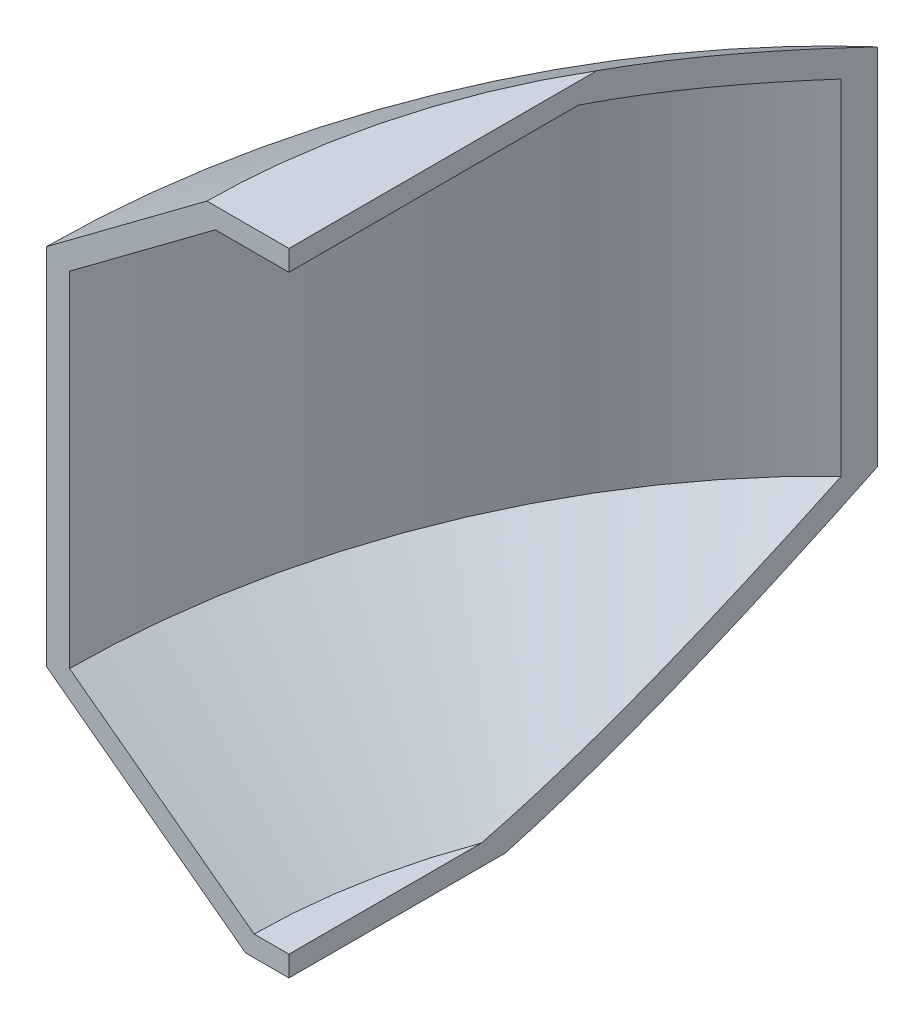
ISO-10303-21;
HEADER;
FILE_DESCRIPTION(('STEP AP214'),'2;1');
FILE_NAME('part.step','',(''),(''),'','','');
FILE_SCHEMA(('AUTOMOTIVE_DESIGN { 1 0 10303 214 1 1 1 1 }'));
ENDSEC;
DATA;
#1=APPLICATION_CONTEXT('core data for automotive mechanical design processes');
#2=APPLICATION_PROTOCOL_DEFINITION('international standard','automotive_design',2000,#1);
#3=PRODUCT_CONTEXT('',#1,'mechanical');
#4=PRODUCT('Part','Part','',(#3));
#5=PRODUCT_RELATED_PRODUCT_CATEGORY('part','',(#4));
#6=PRODUCT_DEFINITION_FORMATION('','',#4);
#7=PRODUCT_DEFINITION_CONTEXT('part definition',#1,'design');
#8=PRODUCT_DEFINITION('design','',#6,#7);
#9=PRODUCT_DEFINITION_SHAPE('','',#8);
#10=(LENGTH_UNIT() NAMED_UNIT(*) SI_UNIT(.MILLI.,.METRE.));
#11=(NAMED_UNIT(*) PLANE_ANGLE_UNIT() SI_UNIT($,.RADIAN.));
#12=(NAMED_UNIT(*) SI_UNIT($,.STERADIAN.) SOLID_ANGLE_UNIT());
#13=UNCERTAINTY_MEASURE_WITH_UNIT(LENGTH_MEASURE(1.E-05),#10,'distance_accuracy_value','');
#14=(GEOMETRIC_REPRESENTATION_CONTEXT(3) GLOBAL_UNCERTAINTY_ASSIGNED_CONTEXT((#13)) GLOBAL_UNIT_ASSIGNED_CONTEXT((#10,
#11,#12)) REPRESENTATION_CONTEXT('',''));
#15=CARTESIAN_POINT('',(0.,0.,0.));
#16=DIRECTION('',(0.,0.,1.));
#17=DIRECTION('',(1.,0.,0.));
#18=AXIS2_PLACEMENT_3D('',#15,#16,#17);
#19=CARTESIAN_POINT('',(-308.554799780113,77.7625120885841,-149.499973367811));
#20=DIRECTION('',(0.,1.,0.));
#21=DIRECTION('',(-1.,0.,0.));
#22=AXIS2_PLACEMENT_3D('',#19,#20,#21);
#23=PLANE('',#22);
#24=DIRECTION('',(1.,0.,0.));
#25=VECTOR('',#24,1.);
#26=CARTESIAN_POINT('',(-308.554799780113,77.7625120885841,-150.));
#27=LINE('',#26,#25);
#28=CARTESIAN_POINT('',(-308.553136985618,77.7625120885841,-150.));
#29=VERTEX_POINT('',#28);
#30=CARTESIAN_POINT('',(-300.,77.7625120885841,-149.999999999977));
#31=VERTEX_POINT('',#30);
#32=EDGE_CURVE('E248',#29,#31,#27,.T.);
#33=ORIENTED_EDGE('',*,*,#32,.F.);
#34=CARTESIAN_POINT('',(-262.506364446809,77.7625120885841,-208.339640738144));
#35=CARTESIAN_POINT('',(-289.480913338998,77.7625120885842,-208.339640738144));
#36=CARTESIAN_POINT('',(-308.554799780113,77.7625120885842,-183.96745250783));
#37=CARTESIAN_POINT('',(-308.554799780113,77.7625120885841,-149.499973367811));
#38=(BOUNDED_CURVE() B_SPLINE_CURVE(3,(#34,#35,#36,#37),.UNSPECIFIED.,.F.,
.F.) B_SPLINE_CURVE_WITH_KNOTS((4,4),(0.,1.),
.UNSPECIFIED.) CURVE() GEOMETRIC_REPRESENTATION_ITEM() RATIONAL_B_SPLINE_CURVE((1.,
0.804737854124365,0.804737854124365,1.)) REPRESENTATION_ITEM(''));
#39=CARTESIAN_POINT('',(-300.,77.7625120885841,-183.659581031771));
#40=VERTEX_POINT('',#39);
#41=EDGE_CURVE('E140',#40,#29,#38,.T.);
#42=ORIENTED_EDGE('',*,*,#41,.F.);
#43=DIRECTION('',(0.,0.,-1.));
#44=VECTOR('',#43,1.);
#45=CARTESIAN_POINT('',(-300.,77.7625120885841,-149.499973367811));
#46=LINE('',#45,#44);
#47=EDGE_CURVE('E249',#31,#40,#46,.T.);
#48=ORIENTED_EDGE('',*,*,#47,.F.);
#49=EDGE_LOOP('',(#33,#42,#48));
#50=FACE_BOUND('',#49,.T.);
#51=ADVANCED_FACE('F34',(#50),#23,.F.);
#52=CARTESIAN_POINT('',(-262.506364446809,25.118910613293,-68.9999733678111));
#53=CARTESIAN_POINT('',(-136.506364446809,25.118910613293,-68.9999733678111));
#54=CARTESIAN_POINT('',(-136.506364446809,25.118910613293,-229.999973367811));
#55=CARTESIAN_POINT('',(-262.506364446809,25.118910613293,-229.999973367811));
#56=CARTESIAN_POINT('',(-388.506364446809,25.118910613293,-229.999973367811));
#57=CARTESIAN_POINT('',(-388.506364446809,25.118910613293,-68.9999733678111));
#58=CARTESIAN_POINT('',(-262.506364446809,25.118910613293,-68.9999733678111));
#59=CARTESIAN_POINT('',(-262.506364446809,9.11891061329302,-96.4103059974782));
#60=CARTESIAN_POINT('',(-179.409493780201,9.11891061329302,-96.4103059974782));
#61=CARTESIAN_POINT('',(-179.409493780201,9.11891061329302,-202.589640738144));
#62=CARTESIAN_POINT('',(-262.506364446809,9.11891061329301,-202.589640738144));
#63=CARTESIAN_POINT('',(-345.603235113417,9.11891061329302,-202.589640738144));
#64=CARTESIAN_POINT('',(-345.603235113417,9.11891061329302,-96.4103059974782));
#65=CARTESIAN_POINT('',(-262.506364446809,9.11891061329302,-96.4103059974782));
#66=(BOUNDED_SURFACE() B_SPLINE_SURFACE(1,3,((#52,#53,#54,#55,#56,#57,#58),(#59,#60,#61,#62,#63,
#64,#65)),.UNSPECIFIED.,.F.,.T.,.F.) B_SPLINE_SURFACE_WITH_KNOTS((2,2),(4,3,4),(0.,1.),(0.,0.5,
1.),.UNSPECIFIED.) GEOMETRIC_REPRESENTATION_ITEM() RATIONAL_B_SPLINE_SURFACE(((1.,
0.333333333333333,0.333333333333333,1.,0.333333333333333,0.333333333333333,1.),(1.,
0.333333333333333,0.333333333333333,1.,0.333333333333333,0.333333333333333,1.))) REPRESENTATION_ITEM('') SURFACE());
#67=CARTESIAN_POINT('',(-304.052956885192,9.11891061329304,-150.));
#68=CARTESIAN_POINT('',(-307.628340446863,11.7855528822422,-150.));
#69=CARTESIAN_POINT('',(-311.203712055111,14.4522111779688,-150.));
#70=CARTESIAN_POINT('',(-316.566757961196,18.4522140488976,-150.));
#71=CARTESIAN_POINT('',(-318.354438012211,19.785550910457,-150.));
#72=CARTESIAN_POINT('',(-321.929795349428,22.4522283405305,-150.));
#73=CARTESIAN_POINT('',(-323.717472635628,23.7855689090446,-150.));
#74=CARTESIAN_POINT('',(-325.505149074732,25.118910613293,-150.));
#75=B_SPLINE_CURVE_WITH_KNOTS('',3,(#67,#68,#69,#70,#71,#72,#73,#74),.UNSPECIFIED.,.F.,.F.,(4,2,
2,4),(0.,13.3809243861647,20.0713865795136,26.7618487728941),.UNSPECIFIED.);
#76=CARTESIAN_POINT('',(-304.052956885192,9.11891061329304,-150.));
#77=VERTEX_POINT('',#76);
#78=CARTESIAN_POINT('',(-325.505149074732,25.118910613293,-150.));
#79=VERTEX_POINT('',#78);
#80=EDGE_CURVE('E201',#77,#79,#75,.T.);
#81=CARTESIAN_POINT('',(-262.506364446809,9.11891061329304,-202.589640738144));
#82=CARTESIAN_POINT('',(-286.844874369677,9.11891061329305,-202.589640738144));
#83=CARTESIAN_POINT('',(-304.054799780113,9.11891061329304,-180.599180491476));
#84=CARTESIAN_POINT('',(-304.054799780113,9.11891061329305,-149.499973367811));
#85=(BOUNDED_CURVE() B_SPLINE_CURVE(3,(#81,#82,#83,#84),.UNSPECIFIED.,.F.,
.F.) B_SPLINE_CURVE_WITH_KNOTS((4,4),(0.,1.),
.UNSPECIFIED.) CURVE() GEOMETRIC_REPRESENTATION_ITEM() RATIONAL_B_SPLINE_CURVE((1.,
0.804737854124365,0.804737854124365,1.)) REPRESENTATION_ITEM(''));
#86=CARTESIAN_POINT('',(-300.,9.11891061329304,-172.37539950585));
#87=VERTEX_POINT('',#86);
#88=EDGE_CURVE('E62',#87,#77,#85,.T.);
#89=CARTESIAN_POINT('',(-300.,25.118910613293,-214.191721987742));
#90=CARTESIAN_POINT('',(-300.,24.8041801312262,-213.520779730799));
#91=CARTESIAN_POINT('',(-300.,24.4908647909483,-212.84917240564));
#92=CARTESIAN_POINT('',(-300.,23.8672760024611,-211.504534463612));
#93=CARTESIAN_POINT('',(-300.,23.557002601907,-210.831503824646));
#94=CARTESIAN_POINT('',(-300.,22.9397179104042,-209.483944354385));
#95=CARTESIAN_POINT('',(-300.,22.632706632672,-208.809415517034));
#96=CARTESIAN_POINT('',(-300.,22.0220166462799,-207.45839269275));
#97=CARTESIAN_POINT('',(-300.,21.7183399132492,-206.781897812562));
#98=CARTESIAN_POINT('',(-300.,21.1147577516216,-205.427229363831));
#99=CARTESIAN_POINT('',(-300.,20.8148523115964,-204.749055800382));
#100=CARTESIAN_POINT('',(-300.,20.2190983475308,-203.390926986662));
#101=CARTESIAN_POINT('',(-300.,19.9232498346193,-202.710971731509));
#102=CARTESIAN_POINT('',(-300.,19.1890513725851,-201.008641670803));
#103=CARTESIAN_POINT('',(-300.,18.7534315119038,-199.985087017534));
#104=CARTESIAN_POINT('',(-300.,17.893199835153,-197.933368990568));
#105=CARTESIAN_POINT('',(-300.,17.4685879223539,-196.905205657462));
#106=CARTESIAN_POINT('',(-300.,16.6318589233325,-194.844217420459));
#107=CARTESIAN_POINT('',(-300.,16.2197375431437,-193.811394262063));
#108=CARTESIAN_POINT('',(-300.,15.4093518088096,-191.740273750682));
#109=CARTESIAN_POINT('',(-300.,15.0110879549621,-190.701976201609));
#110=CARTESIAN_POINT('',(-300.,14.2668282591192,-188.717248748675));
#111=CARTESIAN_POINT('',(-300.,13.9194351432028,-187.7713433139));
#112=CARTESIAN_POINT('',(-300.,13.2389410839069,-185.874410467796));
#113=CARTESIAN_POINT('',(-300.,12.9058399551641,-184.923383123077));
#114=CARTESIAN_POINT('',(-300.,12.2555778858956,-183.015962839192));
#115=CARTESIAN_POINT('',(-300.,11.9384157641036,-182.059570303506));
#116=CARTESIAN_POINT('',(-300.,11.3214346418529,-180.139911213063));
#117=CARTESIAN_POINT('',(-300.,11.0216372442761,-179.176637702464));
#118=CARTESIAN_POINT('',(-300.,10.4417577026158,-177.244071132216));
#119=CARTESIAN_POINT('',(-300.,10.1616771055906,-176.274777606691));
#120=CARTESIAN_POINT('',(-300.,9.62334528932079,-174.329819640564));
#121=CARTESIAN_POINT('',(-300.,9.36510113062626,-173.354153248386));
#122=CARTESIAN_POINT('',(-300.,9.11891061329303,-172.37539950585));
#123=B_SPLINE_CURVE_WITH_KNOTS('',3,(#89,#90,#91,#92,#93,#94,#95,#96,#97,#98,#99,#100,#101,#102,
#103,#104,#105,#106,#107,#108,#109,#110,#111,#112,#113,#114,#115,#116,#117,#118,#119,#120,#121,
#122),.UNSPECIFIED.,.F.,.F.,(4,2,2,2,2,2,2,2,2,2,2,2,2,2,2,2,4),(0.,2.22327891813409,
4.44659261089788,6.66991530801312,8.89449099290365,11.1190599350365,13.3436349784279,
16.6807684424738,20.0178725723907,23.3538161590249,26.6898800583827,29.7128185149026,
32.7357177528233,35.7583926272595,38.7847505283424,41.8113456253906,44.8389156230268),.UNSPECIFIED.);
#124=CARTESIAN_POINT('',(-300.,25.118910613293,-214.191721987742));
#125=VERTEX_POINT('',#124);
#126=EDGE_CURVE('E208',#125,#87,#123,.T.);
#127=CARTESIAN_POINT('',(-262.506364446809,25.118910613293,-229.999973367811));
#128=CARTESIAN_POINT('',(-299.410910017304,25.118910613293,-229.999973367811));
#129=CARTESIAN_POINT('',(-325.506364446809,25.118910613293,-196.655781596777));
#130=CARTESIAN_POINT('',(-325.506364446809,25.118910613293,-149.499973367811));
#131=(BOUNDED_CURVE() B_SPLINE_CURVE(3,(#127,#128,#129,#130),.UNSPECIFIED.,.F.,
.F.) B_SPLINE_CURVE_WITH_KNOTS((4,4),(0.,1.),
.UNSPECIFIED.) CURVE() GEOMETRIC_REPRESENTATION_ITEM() RATIONAL_B_SPLINE_CURVE((1.,
0.804737854124365,0.804737854124365,1.)) REPRESENTATION_ITEM(''));
#132=EDGE_CURVE('E54',#125,#79,#131,.T.);
#133=ORIENTED_EDGE('',*,*,#80,.F.);
#134=ORIENTED_EDGE('',*,*,#88,.F.);
#135=ORIENTED_EDGE('',*,*,#126,.F.);
#136=ORIENTED_EDGE('',*,*,#132,.T.);
#137=EDGE_LOOP('',(#133,#134,#135,#136));
#138=FACE_BOUND('',#137,.T.);
#139=ADVANCED_FACE('F213',(#138),#66,.F.);
#140=CARTESIAN_POINT('',(-304.054799780113,9.11891061329305,-149.499973367811));
#141=DIRECTION('',(0.,-1.,0.));
#142=DIRECTION('',(1.,0.,0.));
#143=AXIS2_PLACEMENT_3D('',#140,#141,#142);
#144=PLANE('',#143);
#145=DIRECTION('',(-1.,0.,0.));
#146=VECTOR('',#145,1.);
#147=CARTESIAN_POINT('',(-304.054799780113,9.11891061329304,-150.));
#148=LINE('',#147,#146);
#149=CARTESIAN_POINT('',(-300.,9.11891061329304,-149.999999999977));
#150=VERTEX_POINT('',#149);
#151=EDGE_CURVE('E155',#150,#77,#148,.T.);
#152=ORIENTED_EDGE('',*,*,#151,.F.);
#153=DIRECTION('',(0.,0.,1.));
#154=VECTOR('',#153,1.);
#155=CARTESIAN_POINT('',(-300.,9.11891061329304,-149.499973367811));
#156=LINE('',#155,#154);
#157=EDGE_CURVE('E237',#87,#150,#156,.T.);
#158=ORIENTED_EDGE('',*,*,#157,.F.);
#159=ORIENTED_EDGE('',*,*,#88,.T.);
#160=EDGE_LOOP('',(#152,#158,#159));
#161=FACE_BOUND('',#160,.T.);
#162=ADVANCED_FACE('F187',(#161),#144,.F.);
#163=CARTESIAN_POINT('',(-262.506364446809,9.11891061329304,-68.999973367811));
#164=CARTESIAN_POINT('',(-136.506364446809,9.11891061329304,-68.9999733678111));
#165=CARTESIAN_POINT('',(-136.506364446809,9.11891061329304,-229.999973367811));
#166=CARTESIAN_POINT('',(-262.506364446809,9.11891061329304,-229.999973367811));
#167=CARTESIAN_POINT('',(-388.506364446809,9.11891061329304,-229.999973367811));
#168=CARTESIAN_POINT('',(-388.506364446809,9.11891061329304,-68.9999733678111));
#169=CARTESIAN_POINT('',(-262.506364446809,9.11891061329304,-68.999973367811));
#170=(BOUNDED_CURVE() B_SPLINE_CURVE(3,(#163,#164,#165,#166,#167,#168,#169),.UNSPECIFIED.,.T.,
.F.) B_SPLINE_CURVE_WITH_KNOTS((4,3,4),(0.,0.5,1.),
.UNSPECIFIED.) CURVE() GEOMETRIC_REPRESENTATION_ITEM() RATIONAL_B_SPLINE_CURVE((1.,
0.333333333333333,0.333333333333333,1.,0.333333333333333,0.333333333333333,1.)) REPRESENTATION_ITEM(''));
#171=DIRECTION('',(0.,1.,0.));
#172=VECTOR('',#171,1.);
#173=SURFACE_OF_LINEAR_EXTRUSION('',#170,#172);
#174=DIRECTION('',(0.,1.,0.));
#175=VECTOR('',#174,1.);
#176=CARTESIAN_POINT('',(-325.505149074732,45.118910613293,-150.));
#177=LINE('',#176,#175);
#178=CARTESIAN_POINT('',(-325.505149074732,65.1189106132931,-150.));
#179=VERTEX_POINT('',#178);
#180=EDGE_CURVE('E209',#79,#179,#177,.T.);
#181=ORIENTED_EDGE('',*,*,#180,.F.);
#182=ORIENTED_EDGE('',*,*,#132,.F.);
#183=DIRECTION('',(0.,1.,0.));
#184=VECTOR('',#183,1.);
#185=CARTESIAN_POINT('',(-300.,45.118910613293,-214.191721987742));
#186=LINE('',#185,#184);
#187=CARTESIAN_POINT('',(-300.,65.1189106132931,-214.191721987742));
#188=VERTEX_POINT('',#187);
#189=EDGE_CURVE('E207',#188,#125,#186,.F.);
#190=ORIENTED_EDGE('',*,*,#189,.F.);
#191=CARTESIAN_POINT('',(-262.506364446809,65.1189106132931,-229.999973367811));
#192=CARTESIAN_POINT('',(-299.410910017304,65.1189106132931,-229.999973367811));
#193=CARTESIAN_POINT('',(-325.506364446809,65.1189106132931,-196.655781596777));
#194=CARTESIAN_POINT('',(-325.506364446809,65.1189106132931,-149.499973367811));
#195=(BOUNDED_CURVE() B_SPLINE_CURVE(3,(#191,#192,#193,#194),.UNSPECIFIED.,.F.,
.F.) B_SPLINE_CURVE_WITH_KNOTS((4,4),(0.,1.),
.UNSPECIFIED.) CURVE() GEOMETRIC_REPRESENTATION_ITEM() RATIONAL_B_SPLINE_CURVE((1.,
0.804737854124365,0.804737854124365,1.)) REPRESENTATION_ITEM(''));
#196=EDGE_CURVE('E142',#188,#179,#195,.T.);
#197=ORIENTED_EDGE('',*,*,#196,.T.);
#198=EDGE_LOOP('',(#181,#182,#190,#197));
#199=FACE_BOUND('',#198,.T.);
#200=ADVANCED_FACE('F219',(#199),#173,.F.);
#201=CARTESIAN_POINT('',(-262.506364446809,65.1189106132931,-229.999973367811));
#202=CARTESIAN_POINT('',(-136.506364446809,65.1189106132931,-229.999973367811));
#203=CARTESIAN_POINT('',(-136.506364446809,65.1189106132931,-68.999973367811));
#204=CARTESIAN_POINT('',(-262.506364446809,65.1189106132931,-68.999973367811));
#205=CARTESIAN_POINT('',(-388.506364446809,65.1189106132931,-68.999973367811));
#206=CARTESIAN_POINT('',(-388.506364446809,65.1189106132931,-229.999973367811));
#207=CARTESIAN_POINT('',(-262.506364446809,65.1189106132931,-229.999973367811));
#208=CARTESIAN_POINT('',(-262.506364446809,77.7625120885841,-208.339640738144));
#209=CARTESIAN_POINT('',(-170.409493780201,77.7625120885842,-208.339640738144));
#210=CARTESIAN_POINT('',(-170.409493780201,77.7625120885842,-90.6603059974782));
#211=CARTESIAN_POINT('',(-262.506364446809,77.7625120885841,-90.6603059974781));
#212=CARTESIAN_POINT('',(-354.603235113417,77.7625120885842,-90.6603059974782));
#213=CARTESIAN_POINT('',(-354.603235113417,77.7625120885842,-208.339640738144));
#214=CARTESIAN_POINT('',(-262.506364446809,77.7625120885841,-208.339640738144));
#215=(BOUNDED_SURFACE() B_SPLINE_SURFACE(1,3,((#201,#202,#203,#204,#205,#206,#207),(#208,#209,
#210,#211,#212,#213,#214)),.UNSPECIFIED.,.F.,.T.,.F.) B_SPLINE_SURFACE_WITH_KNOTS((2,2),(4,3,4),
(0.,1.),(0.,0.5,1.),
.UNSPECIFIED.) GEOMETRIC_REPRESENTATION_ITEM() RATIONAL_B_SPLINE_SURFACE(((1.,0.333333333333333,
0.333333333333333,1.,0.333333333333333,0.333333333333333,1.),(1.,0.333333333333333,
0.333333333333333,1.,0.333333333333333,0.333333333333333,1.))) REPRESENTATION_ITEM('') SURFACE());
#216=CARTESIAN_POINT('',(-325.505149074732,65.1189106132931,-150.));
#217=CARTESIAN_POINT('',(-324.092484946622,66.1725488238386,-150.));
#218=CARTESIAN_POINT('',(-322.67982023086,67.226186246493,-150.));
#219=CARTESIAN_POINT('',(-319.85448917577,69.3334589150016,-150.));
#220=CARTESIAN_POINT('',(-318.441822836442,70.3870941608558,-150.));
#221=CARTESIAN_POINT('',(-314.203820710675,73.5479957317227,-150.));
#222=CARTESIAN_POINT('',(-311.378481816496,75.6552578900079,-150.));
#223=CARTESIAN_POINT('',(-308.553136985618,77.7625120885842,-150.));
#224=B_SPLINE_CURVE_WITH_KNOTS('',3,(#216,#217,#218,#219,#220,#221,#222,#223),.UNSPECIFIED.,.F.,
.F.,(4,2,2,4),(0.,5.28696139177814,10.5739227835569,21.1478455672744),.UNSPECIFIED.);
#225=EDGE_CURVE('E192',#179,#29,#224,.T.);
#226=CARTESIAN_POINT('',(-300.,77.7625120885841,-183.659581031771));
#227=CARTESIAN_POINT('',(-300.,77.4803449393689,-184.492173449945));
#228=CARTESIAN_POINT('',(-300.,77.1920782075818,-185.322681867301));
#229=CARTESIAN_POINT('',(-300.,76.6043812242926,-186.979707576226));
#230=CARTESIAN_POINT('',(-300.,76.3049513828677,-187.806225013145));
#231=CARTESIAN_POINT('',(-300.,75.696015738575,-189.455309635366));
#232=CARTESIAN_POINT('',(-300.,75.3865123608729,-190.277877717534));
#233=CARTESIAN_POINT('',(-300.,74.7582588729162,-191.919479708375));
#234=CARTESIAN_POINT('',(-300.,74.4395086631948,-192.738513578921));
#235=CARTESIAN_POINT('',(-300.,73.4274809929911,-195.29989300887));
#236=CARTESIAN_POINT('',(-300.,72.7192702114376,-197.036349371928));
#237=CARTESIAN_POINT('',(-300.,71.2713554225955,-200.496278797821));
#238=CARTESIAN_POINT('',(-300.,70.5316474724866,-202.219750203227));
#239=CARTESIAN_POINT('',(-300.,69.4021593667882,-204.797327100897));
#240=CARTESIAN_POINT('',(-300.,69.0221261154378,-205.655721384238));
#241=CARTESIAN_POINT('',(-300.,68.256100719041,-207.369850647625));
#242=CARTESIAN_POINT('',(-300.,67.8701085605989,-208.225585621686));
#243=CARTESIAN_POINT('',(-300.,67.0927793679216,-209.934385976319));
#244=CARTESIAN_POINT('',(-300.,66.7014435766206,-210.787451922822));
#245=CARTESIAN_POINT('',(-300.,65.913796558411,-212.491274163554));
#246=CARTESIAN_POINT('',(-300.,65.5174853802061,-213.342030480291));
#247=CARTESIAN_POINT('',(-300.,65.1189106132931,-214.191721987742));
#248=B_SPLINE_CURVE_WITH_KNOTS('',3,(#226,#227,#228,#229,#230,#231,#232,#233,#234,#235,#236,
#237,#238,#239,#240,#241,#242,#243,#244,#245,#246,#247),.UNSPECIFIED.,.F.,.F.,(4,2,2,2,2,2,2,2,
2,2,4),(0.,2.63727281120962,5.27444883744885,7.91099460259156,10.5475687391604,16.1731234434804,
21.7993844378394,24.6156387522723,27.431899398634,30.2475157763245,33.0631046136753),.UNSPECIFIED.);
#249=EDGE_CURVE('E242',#40,#188,#248,.T.);
#250=ORIENTED_EDGE('',*,*,#225,.F.);
#251=ORIENTED_EDGE('',*,*,#196,.F.);
#252=ORIENTED_EDGE('',*,*,#249,.F.);
#253=ORIENTED_EDGE('',*,*,#41,.T.);
#254=EDGE_LOOP('',(#250,#251,#252,#253));
#255=FACE_BOUND('',#254,.T.);
#256=ADVANCED_FACE('F250',(#255),#215,.F.);
#257=CARTESIAN_POINT('',(-300.,0.,0.));
#258=DIRECTION('',(1.,0.,0.));
#259=DIRECTION('',(0.,0.,-1.));
#260=AXIS2_PLACEMENT_3D('',#257,#258,#259);
#261=PLANE('',#260);
#262=DIRECTION('',(0.,-1.,0.));
#263=VECTOR('',#262,1.);
#264=CARTESIAN_POINT('',(-300.,0.,-150.));
#265=LINE('',#264,#263);
#266=CARTESIAN_POINT('',(-300.,80.1625120885842,-149.999999999977));
#267=VERTEX_POINT('',#266);
#268=EDGE_CURVE('E234',#267,#31,#265,.T.);
#269=ORIENTED_EDGE('',*,*,#268,.T.);
#270=ORIENTED_EDGE('',*,*,#47,.T.);
#271=ORIENTED_EDGE('',*,*,#249,.T.);
#272=ORIENTED_EDGE('',*,*,#189,.T.);
#273=ORIENTED_EDGE('',*,*,#126,.T.);
#274=ORIENTED_EDGE('',*,*,#157,.T.);
#275=CARTESIAN_POINT('',(-300.,6.71891061329304,-149.999999999977));
#276=VERTEX_POINT('',#275);
#277=EDGE_CURVE('E308',#150,#276,#265,.T.);
#278=ORIENTED_EDGE('',*,*,#277,.T.);
#279=DIRECTION('',(0.,0.,1.));
#280=VECTOR('',#279,1.);
#281=CARTESIAN_POINT('',(-300.,6.71891061329304,-202.589640738144));
#282=LINE('',#281,#280);
#283=CARTESIAN_POINT('',(-300.,6.71891061329304,-175.155206782243));
#284=VERTEX_POINT('',#283);
#285=EDGE_CURVE('E135',#284,#276,#282,.T.);
#286=ORIENTED_EDGE('',*,*,#285,.F.);
#287=CARTESIAN_POINT('',(-300.,23.999772233721,-218.437443871916));
#288=CARTESIAN_POINT('',(-300.,23.6538010052672,-217.715663839617));
#289=CARTESIAN_POINT('',(-300.,23.309261682152,-216.993196192369));
#290=CARTESIAN_POINT('',(-300.,22.6232716158019,-215.546782621346));
#291=CARTESIAN_POINT('',(-300.,22.281820920246,-214.822836674961));
#292=CARTESIAN_POINT('',(-300.,21.6022421502865,-213.37338270204));
#293=CARTESIAN_POINT('',(-300.,21.2641140896318,-212.647874669056));
#294=CARTESIAN_POINT('',(-300.,20.5912548219232,-211.194799643906));
#295=CARTESIAN_POINT('',(-300.,20.256525587335,-210.46723173814));
#296=CARTESIAN_POINT('',(-300.,19.5909355489621,-209.010330543398));
#297=CARTESIAN_POINT('',(-300.,19.2600747330317,-208.280997259974));
#298=CARTESIAN_POINT('',(-300.,18.6025304887918,-206.820448259423));
#299=CARTESIAN_POINT('',(-300.,18.2758470693644,-206.089232538299));
#300=CARTESIAN_POINT('',(-300.,17.4647439634507,-204.25860398079));
#301=CARTESIAN_POINT('',(-300.,16.983146435487,-203.15793828236));
#302=CARTESIAN_POINT('',(-300.,16.03140337192,-200.951670785811));
#303=CARTESIAN_POINT('',(-300.,15.5612577618541,-199.846069019844));
#304=CARTESIAN_POINT('',(-300.,14.634060354243,-197.629813201939));
#305=CARTESIAN_POINT('',(-300.,14.1770042615331,-196.519160949152));
#306=CARTESIAN_POINT('',(-300.,13.2775260766541,-194.291899215723));
#307=CARTESIAN_POINT('',(-300.,12.8351043911213,-193.175289570546));
#308=CARTESIAN_POINT('',(-300.,12.04300862195,-191.13196530791));
#309=CARTESIAN_POINT('',(-300.,11.6906736987326,-190.206282578249));
#310=CARTESIAN_POINT('',(-300.,10.9985825021545,-188.350233414606));
#311=CARTESIAN_POINT('',(-300.,10.6588260615626,-187.419867043079));
#312=CARTESIAN_POINT('',(-300.,9.99331398044432,-185.554196041878));
#313=CARTESIAN_POINT('',(-300.,9.66755748758396,-184.618891716737));
#314=CARTESIAN_POINT('',(-300.,9.03126935316459,-182.742056837038));
#315=CARTESIAN_POINT('',(-300.,8.7207534252646,-181.80052094693));
#316=CARTESIAN_POINT('',(-300.,8.11700429773031,-179.911840940126));
#317=CARTESIAN_POINT('',(-300.,7.82377220199722,-178.964696469457));
#318=CARTESIAN_POINT('',(-300.,7.2564652951345,-177.064425201386));
#319=CARTESIAN_POINT('',(-300.,6.98239549925028,-176.111296908475));
#320=CARTESIAN_POINT('',(-300.,6.71891061329305,-175.155206782244));
#321=B_SPLINE_CURVE_WITH_KNOTS('',3,(#287,#288,#289,#290,#291,#292,#293,#294,#295,#296,#297,
#298,#299,#300,#301,#302,#303,#304,#305,#306,#307,#308,#309,#310,#311,#312,#313,#314,#315,#316,
#317,#318,#319,#320),.UNSPECIFIED.,.F.,.F.,(4,2,2,2,2,2,2,2,2,2,2,2,2,2,2,2,4),(0.,
2.40124197711561,4.80252095899999,7.20380987292656,9.60642071409372,12.0090240096292,
14.4116324127852,18.0158213736707,21.6199868932413,25.2229558749435,28.8260248859139,
31.7973513228791,34.7686382417895,37.7397440081076,40.7138513872018,43.6881485142086,
46.6632211963434),.UNSPECIFIED.);
#322=CARTESIAN_POINT('',(-300.000000000004,23.999772233721,-218.437443871912));
#323=VERTEX_POINT('',#322);
#324=EDGE_CURVE('E118',#323,#284,#321,.T.);
#325=ORIENTED_EDGE('',*,*,#324,.F.);
#326=DIRECTION('',(0.,1.,0.));
#327=VECTOR('',#326,1.);
#328=CARTESIAN_POINT('',(-300.,45.118910613293,-218.437443871916));
#329=LINE('',#328,#327);
#330=CARTESIAN_POINT('',(-300.000000000004,66.238048992865,-218.437443871912));
#331=VERTEX_POINT('',#330);
#332=EDGE_CURVE('E132',#331,#323,#329,.F.);
#333=ORIENTED_EDGE('',*,*,#332,.F.);
#334=CARTESIAN_POINT('',(-300.000000000003,80.1625120885842,-185.779791384881));
#335=CARTESIAN_POINT('',(-300.000000000001,79.8407056132366,-186.692921400951));
#336=CARTESIAN_POINT('',(-300.,79.5120799696343,-187.603627310661));
#337=CARTESIAN_POINT('',(-300.,78.8424489137553,-189.420438258746));
#338=CARTESIAN_POINT('',(-300.,78.5014439947108,-190.326543478792));
#339=CARTESIAN_POINT('',(-300.,77.808371191961,-192.134253804509));
#340=CARTESIAN_POINT('',(-300.,77.4563060112333,-193.03585994823));
#341=CARTESIAN_POINT('',(-300.,76.7421049209156,-194.835080514446));
#342=CARTESIAN_POINT('',(-300.,76.3799688967463,-195.73269489139));
#343=CARTESIAN_POINT('',(-300.,75.2590852478994,-198.470923932254));
#344=CARTESIAN_POINT('',(-300.,74.4856716472608,-200.305544004782));
#345=CARTESIAN_POINT('',(-300.,72.9075026232209,-203.961455460708));
#346=CARTESIAN_POINT('',(-300.,72.1027434723404,-205.782745228143));
#347=CARTESIAN_POINT('',(-300.,70.8759224676067,-208.506852800011));
#348=CARTESIAN_POINT('',(-300.,70.4634950331474,-209.414026307234));
#349=CARTESIAN_POINT('',(-300.,69.6327687779101,-211.225684342309));
#350=CARTESIAN_POINT('',(-300.,69.2144699460814,-212.130168865096));
#351=CARTESIAN_POINT('',(-300.,68.3726238706003,-213.936453180554));
#352=CARTESIAN_POINT('',(-300.,67.9490777750933,-214.838253508802));
#353=CARTESIAN_POINT('',(-300.,67.0971082900034,-216.63953829833));
#354=CARTESIAN_POINT('',(-300.,66.6686849424899,-217.539022779503));
#355=CARTESIAN_POINT('',(-300.,66.2380489928651,-218.437443871916));
#356=B_SPLINE_CURVE_WITH_KNOTS('',3,(#334,#335,#336,#337,#338,#339,#340,#341,#342,#343,#344,
#345,#346,#347,#348,#349,#350,#351,#352,#353,#354,#355),.UNSPECIFIED.,.F.,.F.,(4,2,2,2,2,2,2,2,
2,2,4),(0.,2.90447377445638,5.8088319515769,8.71248578160656,11.6161726609681,17.5887131909096,
23.5619661312998,26.5515209520049,29.5410814002228,32.5299988721468,35.5188905823076),.UNSPECIFIED.);
#357=CARTESIAN_POINT('',(-300.,80.1625120885842,-185.77979138489));
#358=VERTEX_POINT('',#357);
#359=EDGE_CURVE('E168',#358,#331,#356,.T.);
#360=ORIENTED_EDGE('',*,*,#359,.F.);
#361=DIRECTION('',(0.,0.,-1.));
#362=VECTOR('',#361,1.);
#363=CARTESIAN_POINT('',(-300.,80.1625120885842,-208.339640738144));
#364=LINE('',#363,#362);
#365=EDGE_CURVE('E158',#267,#358,#364,.T.);
#366=ORIENTED_EDGE('',*,*,#365,.F.);
#367=EDGE_LOOP('',(#269,#270,#271,#272,#273,#274,#278,#286,#325,#333,#360,#366));
#368=FACE_BOUND('',#367,.T.);
#369=ADVANCED_FACE('F36',(#368),#261,.T.);
#370=CARTESIAN_POINT('',(0.,0.,-150.));
#371=DIRECTION('',(0.,0.,1.));
#372=DIRECTION('',(1.,0.,0.));
#373=AXIS2_PLACEMENT_3D('',#370,#371,#372);
#374=PLANE('',#373);
#375=ORIENTED_EDGE('',*,*,#225,.T.);
#376=ORIENTED_EDGE('',*,*,#32,.T.);
#377=ORIENTED_EDGE('',*,*,#268,.F.);
#378=DIRECTION('',(1.,0.,0.));
#379=VECTOR('',#378,1.);
#380=CARTESIAN_POINT('',(-262.506364446809,80.1625120885842,-150.));
#381=LINE('',#380,#379);
#382=CARTESIAN_POINT('',(-309.535891363573,80.1625120885842,-150.));
#383=VERTEX_POINT('',#382);
#384=EDGE_CURVE('E156',#383,#267,#381,.T.);
#385=ORIENTED_EDGE('',*,*,#384,.F.);
#386=CARTESIAN_POINT('',(-328.205199022434,66.2380489928651,-150.));
#387=CARTESIAN_POINT('',(-326.649427250462,67.3984261011906,-150.));
#388=CARTESIAN_POINT('',(-325.093654860967,68.5588023815772,-150.));
#389=CARTESIAN_POINT('',(-321.982108323368,70.8795525844969,-150.));
#390=CARTESIAN_POINT('',(-320.426334175265,72.03992650703,-150.));
#391=CARTESIAN_POINT('',(-315.759008307658,75.5210436849199,-150.));
#392=CARTESIAN_POINT('',(-312.647453164903,77.8417823505328,-150.));
#393=CARTESIAN_POINT('',(-309.535891363573,80.1625120885842,-150.));
#394=B_SPLINE_CURVE_WITH_KNOTS('',3,(#386,#387,#388,#389,#390,#391,#392,#393),.UNSPECIFIED.,.F.,
.F.,(4,2,2,4),(0.,5.82255163652144,11.6451032730435,23.2902065462617),.UNSPECIFIED.);
#395=CARTESIAN_POINT('',(-328.205199022434,66.238048992865,-150.));
#396=VERTEX_POINT('',#395);
#397=EDGE_CURVE('E159',#396,#383,#394,.T.);
#398=ORIENTED_EDGE('',*,*,#397,.F.);
#399=DIRECTION('',(0.,1.,0.));
#400=VECTOR('',#399,1.);
#401=CARTESIAN_POINT('',(-328.205199022434,45.118910613293,-150.));
#402=LINE('',#401,#400);
#403=CARTESIAN_POINT('',(-328.205199022434,23.999772233721,-150.));
#404=VERTEX_POINT('',#403);
#405=EDGE_CURVE('E136',#404,#396,#402,.T.);
#406=ORIENTED_EDGE('',*,*,#405,.F.);
#407=CARTESIAN_POINT('',(-305.035719101238,6.71891061329305,-150.));
#408=CARTESIAN_POINT('',(-308.897318413499,9.5990283057728,-150.));
#409=CARTESIAN_POINT('',(-312.758904931546,12.4791631523009,-150.));
#410=CARTESIAN_POINT('',(-318.551272563194,16.7993817063369,-150.));
#411=CARTESIAN_POINT('',(-320.482059749543,18.2394572717505,-150.));
#412=CARTESIAN_POINT('',(-324.343631248055,21.1196122561663,-150.));
#413=CARTESIAN_POINT('',(-326.274415560217,22.5596916751683,-150.));
#414=CARTESIAN_POINT('',(-328.205199022434,23.999772233721,-150.));
#415=B_SPLINE_CURVE_WITH_KNOTS('',3,(#407,#408,#409,#410,#411,#412,#413,#414),.UNSPECIFIED.,.F.,
.F.,(4,2,2,4),(0.,14.4521017341432,21.6781526014931,28.904203468875),.UNSPECIFIED.);
#416=CARTESIAN_POINT('',(-305.035719101238,6.71891061329304,-150.));
#417=VERTEX_POINT('',#416);
#418=EDGE_CURVE('E120',#417,#404,#415,.T.);
#419=ORIENTED_EDGE('',*,*,#418,.F.);
#420=DIRECTION('',(-1.,0.,0.));
#421=VECTOR('',#420,1.);
#422=CARTESIAN_POINT('',(-262.506364446809,6.71891061329304,-150.));
#423=LINE('',#422,#421);
#424=EDGE_CURVE('E152',#276,#417,#423,.T.);
#425=ORIENTED_EDGE('',*,*,#424,.F.);
#426=ORIENTED_EDGE('',*,*,#277,.F.);
#427=ORIENTED_EDGE('',*,*,#151,.T.);
#428=ORIENTED_EDGE('',*,*,#80,.T.);
#429=ORIENTED_EDGE('',*,*,#180,.T.);
#430=EDGE_LOOP('',(#375,#376,#377,#385,#398,#406,#419,#425,#426,#427,#428,#429));
#431=FACE_BOUND('',#430,.T.);
#432=ADVANCED_FACE('F178',(#431),#374,.T.);
#433=CARTESIAN_POINT('',(-262.506364446809,80.1625120885842,-208.339640738144));
#434=DIRECTION('',(0.,1.,0.));
#435=DIRECTION('',(0.,0.,1.));
#436=AXIS2_PLACEMENT_3D('',#433,#434,#435);
#437=PLANE('',#436);
#438=CARTESIAN_POINT('',(-264.345443359509,80.1625120885842,-209.549375240456));
#439=CARTESIAN_POINT('',(-291.02830416045,80.1625120885842,-208.215132860434));
#440=CARTESIAN_POINT('',(-309.537519412632,80.1625120885842,-183.620836645339));
#441=CARTESIAN_POINT('',(-309.537519412632,80.1625120885842,-149.499973367811));
#442=(BOUNDED_CURVE() B_SPLINE_CURVE(3,(#438,#439,#440,#441),.UNSPECIFIED.,.F.,
.F.) B_SPLINE_CURVE_WITH_KNOTS((4,4),(0.,1.),
.UNSPECIFIED.) CURVE() GEOMETRIC_REPRESENTATION_ITEM() RATIONAL_B_SPLINE_CURVE((1.,
0.813866236131488,0.813866236131488,1.)) REPRESENTATION_ITEM(''));
#443=EDGE_CURVE('E288',#358,#383,#442,.T.);
#444=ORIENTED_EDGE('',*,*,#443,.T.);
#445=ORIENTED_EDGE('',*,*,#384,.T.);
#446=ORIENTED_EDGE('',*,*,#365,.T.);
#447=EDGE_LOOP('',(#444,#445,#446));
#448=FACE_BOUND('',#447,.T.);
#449=ADVANCED_FACE('F182',(#448),#437,.T.);
#450=CARTESIAN_POINT('',(-262.506364446809,6.71891061329304,-202.589640738144));
#451=DIRECTION('',(0.,-1.,0.));
#452=DIRECTION('',(0.,0.,-1.));
#453=AXIS2_PLACEMENT_3D('',#450,#451,#452);
#454=PLANE('',#453);
#455=ORIENTED_EDGE('',*,*,#285,.T.);
#456=ORIENTED_EDGE('',*,*,#424,.T.);
#457=CARTESIAN_POINT('',(-305.037519412632,6.71891061329304,-149.499973367811));
#458=CARTESIAN_POINT('',(-305.037519412632,6.71891061329304,-181.334750944395));
#459=CARTESIAN_POINT('',(-287.420538202396,6.71891061329304,-203.845338046362));
#460=CARTESIAN_POINT('',(-262.506364446809,6.71891061329305,-203.845338046362));
#461=(BOUNDED_CURVE() B_SPLINE_CURVE(3,(#457,#458,#459,#460),.UNSPECIFIED.,.F.,
.F.) B_SPLINE_CURVE_WITH_KNOTS((4,4),(0.,1.),
.UNSPECIFIED.) CURVE() GEOMETRIC_REPRESENTATION_ITEM() RATIONAL_B_SPLINE_CURVE((1.,
0.804737854124365,0.804737854124365,1.)) REPRESENTATION_ITEM(''));
#462=EDGE_CURVE('E11',#284,#417,#461,.F.);
#463=ORIENTED_EDGE('',*,*,#462,.F.);
#464=EDGE_LOOP('',(#455,#456,#463));
#465=FACE_BOUND('',#464,.T.);
#466=ADVANCED_FACE('F273',(#465),#454,.T.);
#467=CARTESIAN_POINT('',(-262.506364446809,66.2380489928651,-233.449973367811));
#468=CARTESIAN_POINT('',(-131.106364446809,66.2380489928651,-233.449973367811));
#469=CARTESIAN_POINT('',(-131.106364446809,66.2380489928651,-65.5499733678111));
#470=CARTESIAN_POINT('',(-262.506364446809,66.2380489928651,-65.5499733678111));
#471=CARTESIAN_POINT('',(-393.906364446809,66.2380489928651,-65.5499733678111));
#472=CARTESIAN_POINT('',(-393.906364446809,66.2380489928651,-233.449973367811));
#473=CARTESIAN_POINT('',(-262.506364446809,66.2380489928651,-233.449973367811));
#474=CARTESIAN_POINT('',(-262.506364446809,80.1625120885842,-209.595338046362));
#475=CARTESIAN_POINT('',(-168.444054515164,80.1625120885842,-209.595338046362));
#476=CARTESIAN_POINT('',(-168.444054515164,80.1625120885842,-89.4046086892599));
#477=CARTESIAN_POINT('',(-262.506364446809,80.1625120885842,-89.4046086892599));
#478=CARTESIAN_POINT('',(-356.568674378455,80.1625120885842,-89.4046086892598));
#479=CARTESIAN_POINT('',(-356.568674378455,80.1625120885842,-209.595338046362));
#480=CARTESIAN_POINT('',(-262.506364446809,80.1625120885842,-209.595338046362));
#481=(BOUNDED_SURFACE() B_SPLINE_SURFACE(1,3,((#467,#468,#469,#470,#471,#472,#473),(#474,#475,
#476,#477,#478,#479,#480)),.UNSPECIFIED.,.F.,.T.,.F.) B_SPLINE_SURFACE_WITH_KNOTS((2,2),(4,3,4),
(0.,1.),(0.,0.5,1.),
.UNSPECIFIED.) GEOMETRIC_REPRESENTATION_ITEM() RATIONAL_B_SPLINE_SURFACE(((1.,0.333333333333333,
0.333333333333333,1.,0.333333333333333,0.333333333333333,1.),(1.,0.333333333333333,
0.333333333333333,1.,0.333333333333333,0.333333333333333,1.))) REPRESENTATION_ITEM('') SURFACE());
#482=CARTESIAN_POINT('',(-328.206364446809,66.238048992865,-149.499973367811));
#483=CARTESIAN_POINT('',(-328.206364446809,66.238048992865,-198.67674480659));
#484=CARTESIAN_POINT('',(-300.992533398897,66.238048992865,-233.449973367811));
#485=CARTESIAN_POINT('',(-262.506364446809,66.238048992865,-233.449973367811));
#486=(BOUNDED_CURVE() B_SPLINE_CURVE(3,(#482,#483,#484,#485),.UNSPECIFIED.,.F.,
.F.) B_SPLINE_CURVE_WITH_KNOTS((4,4),(0.,1.),
.UNSPECIFIED.) CURVE() GEOMETRIC_REPRESENTATION_ITEM() RATIONAL_B_SPLINE_CURVE((1.,
0.804737854124365,0.804737854124365,1.)) REPRESENTATION_ITEM(''));
#487=EDGE_CURVE('E125',#331,#396,#486,.F.);
#488=ORIENTED_EDGE('',*,*,#487,.T.);
#489=ORIENTED_EDGE('',*,*,#397,.T.);
#490=ORIENTED_EDGE('',*,*,#443,.F.);
#491=ORIENTED_EDGE('',*,*,#359,.T.);
#492=EDGE_LOOP('',(#488,#489,#490,#491));
#493=FACE_BOUND('',#492,.T.);
#494=ADVANCED_FACE('F173',(#493),#481,.T.);
#495=CARTESIAN_POINT('',(-262.506364446809,23.999772233721,-65.549973367811));
#496=CARTESIAN_POINT('',(-131.106364446809,23.999772233721,-65.5499733678111));
#497=CARTESIAN_POINT('',(-131.106364446809,23.999772233721,-233.449973367811));
#498=CARTESIAN_POINT('',(-262.506364446809,23.999772233721,-233.449973367811));
#499=CARTESIAN_POINT('',(-393.906364446809,23.999772233721,-233.449973367811));
#500=CARTESIAN_POINT('',(-393.906364446809,23.999772233721,-65.5499733678111));
#501=CARTESIAN_POINT('',(-262.506364446809,23.999772233721,-65.549973367811));
#502=CARTESIAN_POINT('',(-262.506364446809,6.71891061329304,-95.1546086892598));
#503=CARTESIAN_POINT('',(-177.444054515164,6.71891061329304,-95.1546086892598));
#504=CARTESIAN_POINT('',(-177.444054515164,6.71891061329305,-203.845338046362));
#505=CARTESIAN_POINT('',(-262.506364446809,6.71891061329306,-203.845338046362));
#506=CARTESIAN_POINT('',(-347.568674378455,6.71891061329305,-203.845338046362));
#507=CARTESIAN_POINT('',(-347.568674378455,6.71891061329304,-95.1546086892598));
#508=CARTESIAN_POINT('',(-262.506364446809,6.71891061329304,-95.1546086892598));
#509=(BOUNDED_SURFACE() B_SPLINE_SURFACE(1,3,((#495,#496,#497,#498,#499,#500,#501),(#502,#503,
#504,#505,#506,#507,#508)),.UNSPECIFIED.,.F.,.T.,.F.) B_SPLINE_SURFACE_WITH_KNOTS((2,2),(4,3,4),
(0.,1.),(0.,0.5,1.),
.UNSPECIFIED.) GEOMETRIC_REPRESENTATION_ITEM() RATIONAL_B_SPLINE_SURFACE(((1.,0.333333333333333,
0.333333333333333,1.,0.333333333333333,0.333333333333333,1.),(1.,0.333333333333333,
0.333333333333333,1.,0.333333333333333,0.333333333333333,1.))) REPRESENTATION_ITEM('') SURFACE());
#510=CARTESIAN_POINT('',(-262.506364446809,23.999772233721,-233.449973367811));
#511=CARTESIAN_POINT('',(-300.992533398897,23.999772233721,-233.449973367811));
#512=CARTESIAN_POINT('',(-328.206364446809,23.999772233721,-198.67674480659));
#513=CARTESIAN_POINT('',(-328.206364446809,23.999772233721,-149.499973367811));
#514=(BOUNDED_CURVE() B_SPLINE_CURVE(3,(#510,#511,#512,#513),.UNSPECIFIED.,.F.,
.F.) B_SPLINE_CURVE_WITH_KNOTS((4,4),(0.,1.),
.UNSPECIFIED.) CURVE() GEOMETRIC_REPRESENTATION_ITEM() RATIONAL_B_SPLINE_CURVE((1.,
0.804737854124365,0.804737854124365,1.)) REPRESENTATION_ITEM(''));
#515=EDGE_CURVE('E46',#323,#404,#514,.T.);
#516=ORIENTED_EDGE('',*,*,#462,.T.);
#517=ORIENTED_EDGE('',*,*,#418,.T.);
#518=ORIENTED_EDGE('',*,*,#515,.F.);
#519=ORIENTED_EDGE('',*,*,#324,.T.);
#520=EDGE_LOOP('',(#516,#517,#518,#519));
#521=FACE_BOUND('',#520,.T.);
#522=ADVANCED_FACE('F117',(#521),#509,.T.);
#523=CARTESIAN_POINT('',(-262.506364446809,9.11891061329303,-65.5499733678111));
#524=CARTESIAN_POINT('',(-131.106364446809,9.11891061329304,-65.549973367811));
#525=CARTESIAN_POINT('',(-131.106364446809,9.11891061329304,-233.449973367811));
#526=CARTESIAN_POINT('',(-262.506364446809,9.11891061329304,-233.449973367811));
#527=CARTESIAN_POINT('',(-393.906364446809,9.11891061329304,-233.449973367811));
#528=CARTESIAN_POINT('',(-393.906364446809,9.11891061329304,-65.549973367811));
#529=CARTESIAN_POINT('',(-262.506364446809,9.11891061329303,-65.5499733678111));
#530=(BOUNDED_CURVE() B_SPLINE_CURVE(3,(#523,#524,#525,#526,#527,#528,#529),.UNSPECIFIED.,.T.,
.F.) B_SPLINE_CURVE_WITH_KNOTS((4,3,4),(0.,0.5,1.),
.UNSPECIFIED.) CURVE() GEOMETRIC_REPRESENTATION_ITEM() RATIONAL_B_SPLINE_CURVE((1.,
0.333333333333333,0.333333333333333,1.,0.333333333333333,0.333333333333333,1.)) REPRESENTATION_ITEM(''));
#531=DIRECTION('',(0.,1.,0.));
#532=VECTOR('',#531,1.);
#533=SURFACE_OF_LINEAR_EXTRUSION('',#530,#532);
#534=ORIENTED_EDGE('',*,*,#515,.T.);
#535=ORIENTED_EDGE('',*,*,#405,.T.);
#536=ORIENTED_EDGE('',*,*,#487,.F.);
#537=ORIENTED_EDGE('',*,*,#332,.T.);
#538=EDGE_LOOP('',(#534,#535,#536,#537));
#539=FACE_BOUND('',#538,.T.);
#540=ADVANCED_FACE('F138',(#539),#533,.T.);
#541=CLOSED_SHELL('',(#51,#139,#162,#200,#256,#369,#432,#449,#466,#494,#522,#540));
#542=MANIFOLD_SOLID_BREP('B2',#541);
#543=ADVANCED_BREP_SHAPE_REPRESENTATION('',(#18,#542),#14);
#544=SHAPE_DEFINITION_REPRESENTATION(#9,#543);
ENDSEC;
END-ISO-10303-21;
